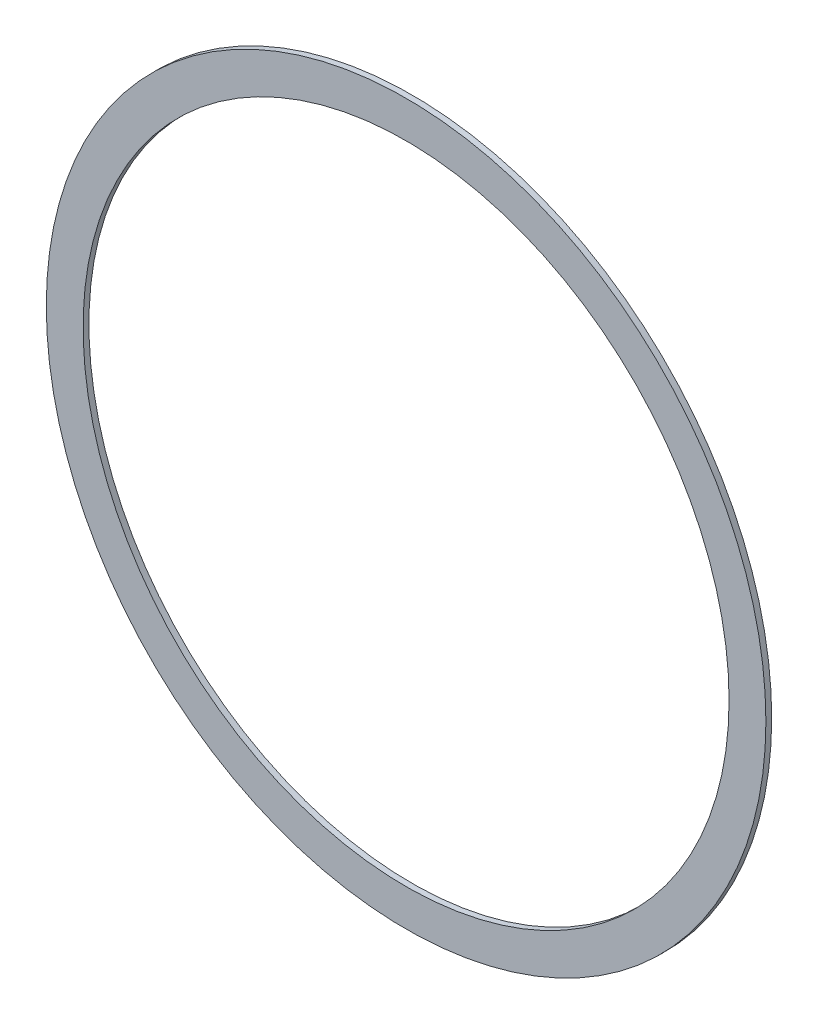
ISO-10303-21;
HEADER;
FILE_DESCRIPTION(('STEP AP214'),'2;1');
FILE_NAME('part.step','',(''),(''),'','','');
FILE_SCHEMA(('AUTOMOTIVE_DESIGN { 1 0 10303 214 1 1 1 1 }'));
ENDSEC;
DATA;
#1=APPLICATION_CONTEXT('core data for automotive mechanical design processes');
#2=APPLICATION_PROTOCOL_DEFINITION('international standard','automotive_design',2000,#1);
#3=PRODUCT_CONTEXT('',#1,'mechanical');
#4=PRODUCT('Part','Part','',(#3));
#5=PRODUCT_RELATED_PRODUCT_CATEGORY('part','',(#4));
#6=PRODUCT_DEFINITION_FORMATION('','',#4);
#7=PRODUCT_DEFINITION_CONTEXT('part definition',#1,'design');
#8=PRODUCT_DEFINITION('design','',#6,#7);
#9=PRODUCT_DEFINITION_SHAPE('','',#8);
#10=(LENGTH_UNIT() NAMED_UNIT(*) SI_UNIT(.MILLI.,.METRE.));
#11=(NAMED_UNIT(*) PLANE_ANGLE_UNIT() SI_UNIT($,.RADIAN.));
#12=(NAMED_UNIT(*) SI_UNIT($,.STERADIAN.) SOLID_ANGLE_UNIT());
#13=UNCERTAINTY_MEASURE_WITH_UNIT(LENGTH_MEASURE(1.E-05),#10,'distance_accuracy_value','');
#14=(GEOMETRIC_REPRESENTATION_CONTEXT(3) GLOBAL_UNCERTAINTY_ASSIGNED_CONTEXT((#13)) GLOBAL_UNIT_ASSIGNED_CONTEXT((#10,
#11,#12)) REPRESENTATION_CONTEXT('',''));
#15=CARTESIAN_POINT('',(0.,0.,0.));
#16=DIRECTION('',(0.,0.,1.));
#17=DIRECTION('',(1.,0.,0.));
#18=AXIS2_PLACEMENT_3D('',#15,#16,#17);
#19=CARTESIAN_POINT('',(0.,0.,4.5));
#20=DIRECTION('',(0.,0.,1.));
#21=DIRECTION('',(1.,0.,0.));
#22=AXIS2_PLACEMENT_3D('',#19,#20,#21);
#23=PLANE('',#22);
#24=CARTESIAN_POINT('',(0.,0.,4.5));
#25=DIRECTION('',(0.,0.,1.));
#26=DIRECTION('',(1.,0.,0.));
#27=AXIS2_PLACEMENT_3D('',#24,#25,#26);
#28=CIRCLE('',#27,278.5);
#29=CARTESIAN_POINT('',(278.5,0.,4.5));
#30=VERTEX_POINT('',#29);
#31=EDGE_CURVE('E10',#30,#30,#28,.T.);
#32=ORIENTED_EDGE('',*,*,#31,.T.);
#33=EDGE_LOOP('',(#32));
#34=FACE_BOUND('',#33,.T.);
#35=CARTESIAN_POINT('',(0.,0.,4.5));
#36=DIRECTION('',(0.,0.,1.));
#37=DIRECTION('',(1.,0.,0.));
#38=AXIS2_PLACEMENT_3D('',#35,#36,#37);
#39=CIRCLE('',#38,250.);
#40=CARTESIAN_POINT('',(250.,0.,4.5));
#41=VERTEX_POINT('',#40);
#42=EDGE_CURVE('E42',#41,#41,#39,.T.);
#43=ORIENTED_EDGE('',*,*,#42,.F.);
#44=EDGE_LOOP('',(#43));
#45=FACE_BOUND('',#44,.T.);
#46=ADVANCED_FACE('F31',(#34,#45),#23,.T.);
#47=CARTESIAN_POINT('',(0.,0.,0.));
#48=DIRECTION('',(0.,0.,1.));
#49=DIRECTION('',(1.,0.,0.));
#50=AXIS2_PLACEMENT_3D('',#47,#48,#49);
#51=PLANE('',#50);
#52=CARTESIAN_POINT('',(0.,0.,0.));
#53=DIRECTION('',(0.,0.,1.));
#54=DIRECTION('',(1.,0.,0.));
#55=AXIS2_PLACEMENT_3D('',#52,#53,#54);
#56=CIRCLE('',#55,278.5);
#57=CARTESIAN_POINT('',(278.5,0.,0.));
#58=VERTEX_POINT('',#57);
#59=EDGE_CURVE('E35',#58,#58,#56,.T.);
#60=ORIENTED_EDGE('',*,*,#59,.F.);
#61=EDGE_LOOP('',(#60));
#62=FACE_BOUND('',#61,.T.);
#63=CARTESIAN_POINT('',(0.,0.,0.));
#64=DIRECTION('',(0.,0.,1.));
#65=DIRECTION('',(1.,0.,0.));
#66=AXIS2_PLACEMENT_3D('',#63,#64,#65);
#67=CIRCLE('',#66,250.);
#68=CARTESIAN_POINT('',(250.,0.,0.));
#69=VERTEX_POINT('',#68);
#70=EDGE_CURVE('E44',#69,#69,#67,.T.);
#71=ORIENTED_EDGE('',*,*,#70,.T.);
#72=EDGE_LOOP('',(#71));
#73=FACE_BOUND('',#72,.T.);
#74=ADVANCED_FACE('F54',(#62,#73),#51,.F.);
#75=CARTESIAN_POINT('',(0.,0.,4.5));
#76=DIRECTION('',(0.,0.,-1.));
#77=DIRECTION('',(-1.,0.,0.));
#78=AXIS2_PLACEMENT_3D('',#75,#76,#77);
#79=CYLINDRICAL_SURFACE('',#78,278.5);
#80=ORIENTED_EDGE('',*,*,#31,.F.);
#81=EDGE_LOOP('',(#80));
#82=FACE_BOUND('',#81,.T.);
#83=ORIENTED_EDGE('',*,*,#59,.T.);
#84=EDGE_LOOP('',(#83));
#85=FACE_BOUND('',#84,.T.);
#86=ADVANCED_FACE('F33',(#82,#85),#79,.T.);
#87=CARTESIAN_POINT('',(0.,0.,4.5));
#88=DIRECTION('',(0.,0.,-1.));
#89=DIRECTION('',(-1.,0.,0.));
#90=AXIS2_PLACEMENT_3D('',#87,#88,#89);
#91=CYLINDRICAL_SURFACE('',#90,250.);
#92=ORIENTED_EDGE('',*,*,#42,.T.);
#93=EDGE_LOOP('',(#92));
#94=FACE_BOUND('',#93,.T.);
#95=ORIENTED_EDGE('',*,*,#70,.F.);
#96=EDGE_LOOP('',(#95));
#97=FACE_BOUND('',#96,.T.);
#98=ADVANCED_FACE('F50',(#94,#97),#91,.F.);
#99=CLOSED_SHELL('',(#46,#74,#86,#98));
#100=MANIFOLD_SOLID_BREP('B2',#99);
#101=ADVANCED_BREP_SHAPE_REPRESENTATION('',(#18,#100),#14);
#102=SHAPE_DEFINITION_REPRESENTATION(#9,#101);
ENDSEC;
END-ISO-10303-21;
